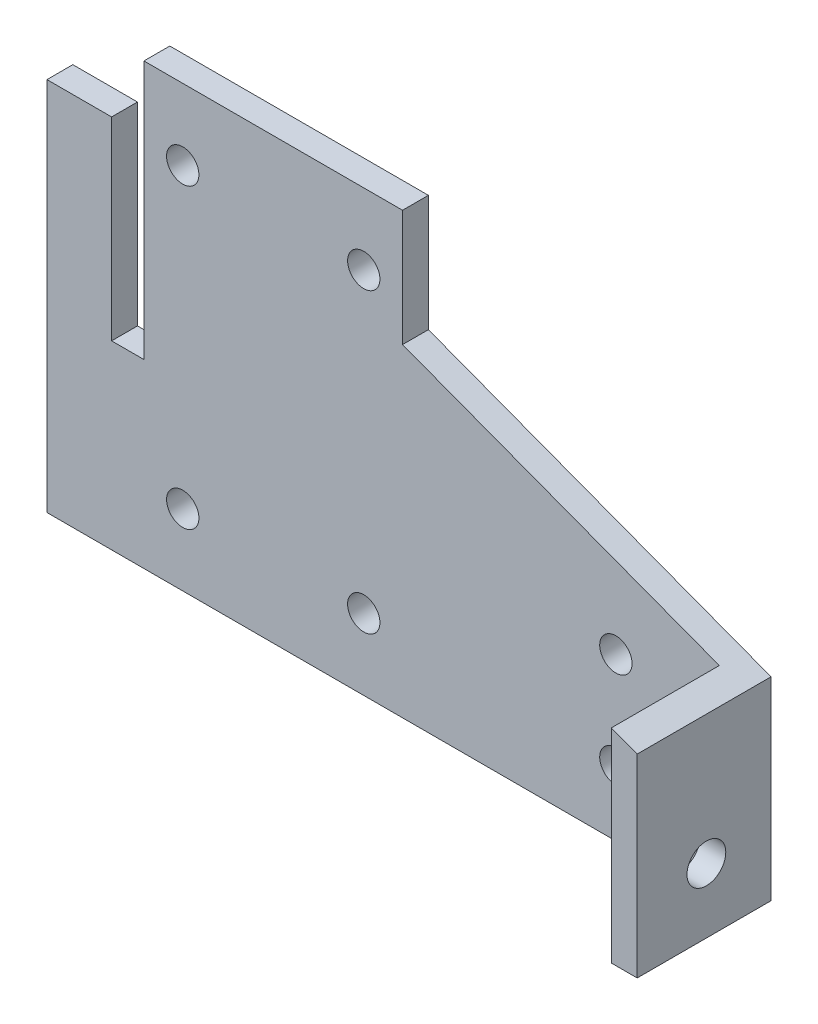
ISO-10303-21;
HEADER;
FILE_DESCRIPTION(('STEP AP214'),'2;1');
FILE_NAME('part.step','',(''),(''),'','','');
FILE_SCHEMA(('AUTOMOTIVE_DESIGN { 1 0 10303 214 1 1 1 1 }'));
ENDSEC;
DATA;
#1=APPLICATION_CONTEXT('core data for automotive mechanical design processes');
#2=APPLICATION_PROTOCOL_DEFINITION('international standard','automotive_design',2000,#1);
#3=PRODUCT_CONTEXT('',#1,'mechanical');
#4=PRODUCT('Part','Part','',(#3));
#5=PRODUCT_RELATED_PRODUCT_CATEGORY('part','',(#4));
#6=PRODUCT_DEFINITION_FORMATION('','',#4);
#7=PRODUCT_DEFINITION_CONTEXT('part definition',#1,'design');
#8=PRODUCT_DEFINITION('design','',#6,#7);
#9=PRODUCT_DEFINITION_SHAPE('','',#8);
#10=(LENGTH_UNIT() NAMED_UNIT(*) SI_UNIT(.MILLI.,.METRE.));
#11=(NAMED_UNIT(*) PLANE_ANGLE_UNIT() SI_UNIT($,.RADIAN.));
#12=(NAMED_UNIT(*) SI_UNIT($,.STERADIAN.) SOLID_ANGLE_UNIT());
#13=UNCERTAINTY_MEASURE_WITH_UNIT(LENGTH_MEASURE(1.E-05),#10,'distance_accuracy_value','');
#14=(GEOMETRIC_REPRESENTATION_CONTEXT(3) GLOBAL_UNCERTAINTY_ASSIGNED_CONTEXT((#13)) GLOBAL_UNIT_ASSIGNED_CONTEXT((#10,
#11,#12)) REPRESENTATION_CONTEXT('',''));
#15=CARTESIAN_POINT('',(0.,0.,0.));
#16=DIRECTION('',(0.,0.,1.));
#17=DIRECTION('',(1.,0.,0.));
#18=AXIS2_PLACEMENT_3D('',#15,#16,#17);
#19=CARTESIAN_POINT('',(0.,0.,4.));
#20=DIRECTION('',(0.,0.,-1.));
#21=DIRECTION('',(-1.,0.,0.));
#22=AXIS2_PLACEMENT_3D('',#19,#20,#21);
#23=PLANE('',#22);
#24=CARTESIAN_POINT('',(88.,25.,4.));
#25=DIRECTION('',(0.,0.,1.));
#26=DIRECTION('',(1.,0.,0.));
#27=AXIS2_PLACEMENT_3D('',#24,#25,#26);
#28=CIRCLE('',#27,2.5);
#29=CARTESIAN_POINT('',(90.5,25.,4.));
#30=VERTEX_POINT('',#29);
#31=EDGE_CURVE('E178',#30,#30,#28,.T.);
#32=ORIENTED_EDGE('',*,*,#31,.F.);
#33=EDGE_LOOP('',(#32));
#34=FACE_BOUND('',#33,.T.);
#35=CARTESIAN_POINT('',(88.,10.,4.));
#36=DIRECTION('',(0.,0.,1.));
#37=DIRECTION('',(1.,0.,0.));
#38=AXIS2_PLACEMENT_3D('',#35,#36,#37);
#39=CIRCLE('',#38,2.5);
#40=CARTESIAN_POINT('',(90.5,10.,4.));
#41=VERTEX_POINT('',#40);
#42=EDGE_CURVE('E186',#41,#41,#39,.T.);
#43=ORIENTED_EDGE('',*,*,#42,.F.);
#44=EDGE_LOOP('',(#43));
#45=FACE_BOUND('',#44,.T.);
#46=CARTESIAN_POINT('',(49.,11.,4.));
#47=DIRECTION('',(0.,0.,1.));
#48=DIRECTION('',(1.,0.,0.));
#49=AXIS2_PLACEMENT_3D('',#46,#47,#48);
#50=CIRCLE('',#49,2.5);
#51=CARTESIAN_POINT('',(51.5,11.,4.));
#52=VERTEX_POINT('',#51);
#53=EDGE_CURVE('E192',#52,#52,#50,.T.);
#54=ORIENTED_EDGE('',*,*,#53,.F.);
#55=EDGE_LOOP('',(#54));
#56=FACE_BOUND('',#55,.T.);
#57=CARTESIAN_POINT('',(21.,11.,4.));
#58=DIRECTION('',(0.,0.,1.));
#59=DIRECTION('',(1.,0.,0.));
#60=AXIS2_PLACEMENT_3D('',#57,#58,#59);
#61=CIRCLE('',#60,2.5);
#62=CARTESIAN_POINT('',(23.5,11.,4.));
#63=VERTEX_POINT('',#62);
#64=EDGE_CURVE('E198',#63,#63,#61,.T.);
#65=ORIENTED_EDGE('',*,*,#64,.F.);
#66=EDGE_LOOP('',(#65));
#67=FACE_BOUND('',#66,.T.);
#68=CARTESIAN_POINT('',(49.,57.,4.));
#69=DIRECTION('',(0.,0.,1.));
#70=DIRECTION('',(1.,0.,0.));
#71=AXIS2_PLACEMENT_3D('',#68,#69,#70);
#72=CIRCLE('',#71,2.5);
#73=CARTESIAN_POINT('',(51.5,57.,4.));
#74=VERTEX_POINT('',#73);
#75=EDGE_CURVE('E204',#74,#74,#72,.T.);
#76=ORIENTED_EDGE('',*,*,#75,.F.);
#77=EDGE_LOOP('',(#76));
#78=FACE_BOUND('',#77,.T.);
#79=CARTESIAN_POINT('',(21.,57.,4.));
#80=DIRECTION('',(0.,0.,1.));
#81=DIRECTION('',(1.,0.,0.));
#82=AXIS2_PLACEMENT_3D('',#79,#80,#81);
#83=CIRCLE('',#82,2.5);
#84=CARTESIAN_POINT('',(23.5,57.,4.));
#85=VERTEX_POINT('',#84);
#86=EDGE_CURVE('E208',#85,#85,#83,.T.);
#87=ORIENTED_EDGE('',*,*,#86,.F.);
#88=EDGE_LOOP('',(#87));
#89=FACE_BOUND('',#88,.T.);
#90=DIRECTION('',(-1.,0.,0.));
#91=VECTOR('',#90,1.);
#92=CARTESIAN_POINT('',(0.,68.,4.));
#93=LINE('',#92,#91);
#94=CARTESIAN_POINT('',(55.,68.,4.));
#95=VERTEX_POINT('',#94);
#96=CARTESIAN_POINT('',(15.,68.,4.));
#97=VERTEX_POINT('',#96);
#98=EDGE_CURVE('E289',#95,#97,#93,.T.);
#99=ORIENTED_EDGE('',*,*,#98,.T.);
#100=DIRECTION('',(0.,1.,0.));
#101=VECTOR('',#100,1.);
#102=CARTESIAN_POINT('',(15.,68.,4.));
#103=LINE('',#102,#101);
#104=CARTESIAN_POINT('',(15.,28.,4.));
#105=VERTEX_POINT('',#104);
#106=EDGE_CURVE('E50',#105,#97,#103,.T.);
#107=ORIENTED_EDGE('',*,*,#106,.F.);
#108=DIRECTION('',(1.,0.,0.));
#109=VECTOR('',#108,1.);
#110=CARTESIAN_POINT('',(15.,28.,4.));
#111=LINE('',#110,#109);
#112=CARTESIAN_POINT('',(10.,28.,4.));
#113=VERTEX_POINT('',#112);
#114=EDGE_CURVE('E332',#113,#105,#111,.T.);
#115=ORIENTED_EDGE('',*,*,#114,.F.);
#116=DIRECTION('',(0.,-1.,0.));
#117=VECTOR('',#116,1.);
#118=CARTESIAN_POINT('',(10.,58.,4.));
#119=LINE('',#118,#117);
#120=CARTESIAN_POINT('',(10.,58.,4.));
#121=VERTEX_POINT('',#120);
#122=EDGE_CURVE('E141',#121,#113,#119,.T.);
#123=ORIENTED_EDGE('',*,*,#122,.F.);
#124=DIRECTION('',(1.,0.,0.));
#125=VECTOR('',#124,1.);
#126=CARTESIAN_POINT('',(0.,58.,4.));
#127=LINE('',#126,#125);
#128=CARTESIAN_POINT('',(0.,58.,4.));
#129=VERTEX_POINT('',#128);
#130=EDGE_CURVE('E127',#129,#121,#127,.T.);
#131=ORIENTED_EDGE('',*,*,#130,.F.);
#132=DIRECTION('',(0.,-1.,0.));
#133=VECTOR('',#132,1.);
#134=CARTESIAN_POINT('',(0.,0.,4.));
#135=LINE('',#134,#133);
#136=CARTESIAN_POINT('',(0.,0.,4.));
#137=VERTEX_POINT('',#136);
#138=EDGE_CURVE('E137',#129,#137,#135,.T.);
#139=ORIENTED_EDGE('',*,*,#138,.T.);
#140=DIRECTION('',(1.,0.,0.));
#141=VECTOR('',#140,1.);
#142=CARTESIAN_POINT('',(0.,0.,4.));
#143=LINE('',#142,#141);
#144=CARTESIAN_POINT('',(104.,0.,4.));
#145=VERTEX_POINT('',#144);
#146=EDGE_CURVE('E146',#137,#145,#143,.T.);
#147=ORIENTED_EDGE('',*,*,#146,.T.);
#148=DIRECTION('',(0.,-1.,0.));
#149=VECTOR('',#148,1.);
#150=CARTESIAN_POINT('',(104.,0.,4.));
#151=LINE('',#150,#149);
#152=CARTESIAN_POINT('',(104.,31.5094339622642,4.));
#153=VERTEX_POINT('',#152);
#154=EDGE_CURVE('E58',#153,#145,#151,.T.);
#155=ORIENTED_EDGE('',*,*,#154,.F.);
#156=DIRECTION('',(-0.935601718950742,0.353057252434242,0.));
#157=VECTOR('',#156,1.);
#158=CARTESIAN_POINT('',(108.,30.,4.));
#159=LINE('',#158,#157);
#160=CARTESIAN_POINT('',(55.,50.,4.));
#161=VERTEX_POINT('',#160);
#162=EDGE_CURVE('E149',#153,#161,#159,.T.);
#163=ORIENTED_EDGE('',*,*,#162,.T.);
#164=DIRECTION('',(0.,1.,0.));
#165=VECTOR('',#164,1.);
#166=CARTESIAN_POINT('',(55.,68.,4.));
#167=LINE('',#166,#165);
#168=EDGE_CURVE('E166',#161,#95,#167,.T.);
#169=ORIENTED_EDGE('',*,*,#168,.T.);
#170=EDGE_LOOP('',(#99,#107,#115,#123,#131,#139,#147,#155,#163,#169));
#171=FACE_BOUND('',#170,.T.);
#172=ADVANCED_FACE('F35',(#34,#45,#56,#67,#78,#89,#171),#23,.F.);
#173=CARTESIAN_POINT('',(0.,0.,0.));
#174=DIRECTION('',(0.,0.,-1.));
#175=DIRECTION('',(-1.,0.,0.));
#176=AXIS2_PLACEMENT_3D('',#173,#174,#175);
#177=PLANE('',#176);
#178=DIRECTION('',(0.,-1.,0.));
#179=VECTOR('',#178,1.);
#180=CARTESIAN_POINT('',(15.,0.,0.));
#181=LINE('',#180,#179);
#182=CARTESIAN_POINT('',(15.,68.,0.));
#183=VERTEX_POINT('',#182);
#184=CARTESIAN_POINT('',(15.,28.,0.));
#185=VERTEX_POINT('',#184);
#186=EDGE_CURVE('E324',#183,#185,#181,.T.);
#187=ORIENTED_EDGE('',*,*,#186,.F.);
#188=DIRECTION('',(-1.,0.,0.));
#189=VECTOR('',#188,1.);
#190=CARTESIAN_POINT('',(0.,68.,0.));
#191=LINE('',#190,#189);
#192=CARTESIAN_POINT('',(55.,68.,0.));
#193=VERTEX_POINT('',#192);
#194=EDGE_CURVE('E147',#193,#183,#191,.T.);
#195=ORIENTED_EDGE('',*,*,#194,.F.);
#196=DIRECTION('',(0.,1.,0.));
#197=VECTOR('',#196,1.);
#198=CARTESIAN_POINT('',(55.,68.,0.));
#199=LINE('',#198,#197);
#200=CARTESIAN_POINT('',(55.,50.,0.));
#201=VERTEX_POINT('',#200);
#202=EDGE_CURVE('E152',#201,#193,#199,.T.);
#203=ORIENTED_EDGE('',*,*,#202,.F.);
#204=DIRECTION('',(-0.935601718950742,0.353057252434242,0.));
#205=VECTOR('',#204,1.);
#206=CARTESIAN_POINT('',(108.,30.,0.));
#207=LINE('',#206,#205);
#208=CARTESIAN_POINT('',(108.,30.,0.));
#209=VERTEX_POINT('',#208);
#210=EDGE_CURVE('E280',#209,#201,#207,.T.);
#211=ORIENTED_EDGE('',*,*,#210,.F.);
#212=DIRECTION('',(0.,1.,0.));
#213=VECTOR('',#212,1.);
#214=CARTESIAN_POINT('',(108.,0.,0.));
#215=LINE('',#214,#213);
#216=CARTESIAN_POINT('',(108.,0.,0.));
#217=VERTEX_POINT('',#216);
#218=EDGE_CURVE('E269',#217,#209,#215,.T.);
#219=ORIENTED_EDGE('',*,*,#218,.F.);
#220=DIRECTION('',(1.,0.,0.));
#221=VECTOR('',#220,1.);
#222=CARTESIAN_POINT('',(0.,0.,0.));
#223=LINE('',#222,#221);
#224=CARTESIAN_POINT('',(0.,0.,0.));
#225=VERTEX_POINT('',#224);
#226=EDGE_CURVE('E213',#225,#217,#223,.T.);
#227=ORIENTED_EDGE('',*,*,#226,.F.);
#228=DIRECTION('',(0.,-1.,0.));
#229=VECTOR('',#228,1.);
#230=CARTESIAN_POINT('',(0.,0.,0.));
#231=LINE('',#230,#229);
#232=CARTESIAN_POINT('',(0.,58.,0.));
#233=VERTEX_POINT('',#232);
#234=EDGE_CURVE('E210',#233,#225,#231,.T.);
#235=ORIENTED_EDGE('',*,*,#234,.F.);
#236=DIRECTION('',(-1.,0.,0.));
#237=VECTOR('',#236,1.);
#238=CARTESIAN_POINT('',(0.,58.,0.));
#239=LINE('',#238,#237);
#240=CARTESIAN_POINT('',(10.,58.,0.));
#241=VERTEX_POINT('',#240);
#242=EDGE_CURVE('E130',#241,#233,#239,.T.);
#243=ORIENTED_EDGE('',*,*,#242,.F.);
#244=DIRECTION('',(0.,1.,0.));
#245=VECTOR('',#244,1.);
#246=CARTESIAN_POINT('',(10.,0.,0.));
#247=LINE('',#246,#245);
#248=CARTESIAN_POINT('',(10.,28.,0.));
#249=VERTEX_POINT('',#248);
#250=EDGE_CURVE('E43',#249,#241,#247,.T.);
#251=ORIENTED_EDGE('',*,*,#250,.F.);
#252=DIRECTION('',(-1.,0.,0.));
#253=VECTOR('',#252,1.);
#254=CARTESIAN_POINT('',(0.,28.,0.));
#255=LINE('',#254,#253);
#256=EDGE_CURVE('E11',#185,#249,#255,.T.);
#257=ORIENTED_EDGE('',*,*,#256,.F.);
#258=EDGE_LOOP('',(#187,#195,#203,#211,#219,#227,#235,#243,#251,#257));
#259=FACE_BOUND('',#258,.T.);
#260=CARTESIAN_POINT('',(88.,10.,0.));
#261=DIRECTION('',(0.,0.,1.));
#262=DIRECTION('',(1.,0.,0.));
#263=AXIS2_PLACEMENT_3D('',#260,#261,#262);
#264=CIRCLE('',#263,2.5);
#265=CARTESIAN_POINT('',(90.5,10.,0.));
#266=VERTEX_POINT('',#265);
#267=EDGE_CURVE('E181',#266,#266,#264,.T.);
#268=ORIENTED_EDGE('',*,*,#267,.T.);
#269=EDGE_LOOP('',(#268));
#270=FACE_BOUND('',#269,.T.);
#271=CARTESIAN_POINT('',(21.,11.,0.));
#272=DIRECTION('',(0.,0.,1.));
#273=DIRECTION('',(1.,0.,0.));
#274=AXIS2_PLACEMENT_3D('',#271,#272,#273);
#275=CIRCLE('',#274,2.5);
#276=CARTESIAN_POINT('',(23.5,11.,0.));
#277=VERTEX_POINT('',#276);
#278=EDGE_CURVE('E195',#277,#277,#275,.T.);
#279=ORIENTED_EDGE('',*,*,#278,.T.);
#280=EDGE_LOOP('',(#279));
#281=FACE_BOUND('',#280,.T.);
#282=CARTESIAN_POINT('',(21.,57.,0.));
#283=DIRECTION('',(0.,0.,1.));
#284=DIRECTION('',(1.,0.,0.));
#285=AXIS2_PLACEMENT_3D('',#282,#283,#284);
#286=CIRCLE('',#285,2.5);
#287=CARTESIAN_POINT('',(23.5,57.,0.));
#288=VERTEX_POINT('',#287);
#289=EDGE_CURVE('E156',#288,#288,#286,.T.);
#290=ORIENTED_EDGE('',*,*,#289,.T.);
#291=EDGE_LOOP('',(#290));
#292=FACE_BOUND('',#291,.T.);
#293=CARTESIAN_POINT('',(49.,57.,0.));
#294=DIRECTION('',(0.,0.,1.));
#295=DIRECTION('',(1.,0.,0.));
#296=AXIS2_PLACEMENT_3D('',#293,#294,#295);
#297=CIRCLE('',#296,2.5);
#298=CARTESIAN_POINT('',(51.5,57.,0.));
#299=VERTEX_POINT('',#298);
#300=EDGE_CURVE('E201',#299,#299,#297,.T.);
#301=ORIENTED_EDGE('',*,*,#300,.T.);
#302=EDGE_LOOP('',(#301));
#303=FACE_BOUND('',#302,.T.);
#304=CARTESIAN_POINT('',(49.,11.,0.));
#305=DIRECTION('',(0.,0.,1.));
#306=DIRECTION('',(1.,0.,0.));
#307=AXIS2_PLACEMENT_3D('',#304,#305,#306);
#308=CIRCLE('',#307,2.5);
#309=CARTESIAN_POINT('',(51.5,11.,0.));
#310=VERTEX_POINT('',#309);
#311=EDGE_CURVE('E189',#310,#310,#308,.T.);
#312=ORIENTED_EDGE('',*,*,#311,.T.);
#313=EDGE_LOOP('',(#312));
#314=FACE_BOUND('',#313,.T.);
#315=CARTESIAN_POINT('',(88.,25.,0.));
#316=DIRECTION('',(0.,0.,1.));
#317=DIRECTION('',(1.,0.,0.));
#318=AXIS2_PLACEMENT_3D('',#315,#316,#317);
#319=CIRCLE('',#318,2.5);
#320=CARTESIAN_POINT('',(90.5,25.,0.));
#321=VERTEX_POINT('',#320);
#322=EDGE_CURVE('E182',#321,#321,#319,.T.);
#323=ORIENTED_EDGE('',*,*,#322,.T.);
#324=EDGE_LOOP('',(#323));
#325=FACE_BOUND('',#324,.T.);
#326=ADVANCED_FACE('F218',(#259,#270,#281,#292,#303,#314,#325),#177,.T.);
#327=CARTESIAN_POINT('',(0.,0.,4.));
#328=DIRECTION('',(1.,0.,0.));
#329=DIRECTION('',(0.,0.,-1.));
#330=AXIS2_PLACEMENT_3D('',#327,#328,#329);
#331=PLANE('',#330);
#332=ORIENTED_EDGE('',*,*,#138,.F.);
#333=DIRECTION('',(0.,0.,1.));
#334=VECTOR('',#333,1.);
#335=CARTESIAN_POINT('',(0.,58.,-6.));
#336=LINE('',#335,#334);
#337=EDGE_CURVE('E123',#233,#129,#336,.T.);
#338=ORIENTED_EDGE('',*,*,#337,.F.);
#339=ORIENTED_EDGE('',*,*,#234,.T.);
#340=DIRECTION('',(0.,0.,-1.));
#341=VECTOR('',#340,1.);
#342=CARTESIAN_POINT('',(0.,0.,4.));
#343=LINE('',#342,#341);
#344=EDGE_CURVE('E145',#137,#225,#343,.T.);
#345=ORIENTED_EDGE('',*,*,#344,.F.);
#346=EDGE_LOOP('',(#332,#338,#339,#345));
#347=FACE_BOUND('',#346,.T.);
#348=ADVANCED_FACE('F37',(#347),#331,.F.);
#349=CARTESIAN_POINT('',(0.,0.,4.));
#350=DIRECTION('',(0.,1.,0.));
#351=DIRECTION('',(0.,0.,1.));
#352=AXIS2_PLACEMENT_3D('',#349,#350,#351);
#353=PLANE('',#352);
#354=ORIENTED_EDGE('',*,*,#226,.T.);
#355=DIRECTION('',(0.,0.,-1.));
#356=VECTOR('',#355,1.);
#357=CARTESIAN_POINT('',(108.,0.,4.));
#358=LINE('',#357,#356);
#359=CARTESIAN_POINT('',(108.,0.,20.7));
#360=VERTEX_POINT('',#359);
#361=EDGE_CURVE('E266',#360,#217,#358,.T.);
#362=ORIENTED_EDGE('',*,*,#361,.F.);
#363=DIRECTION('',(1.,0.,0.));
#364=VECTOR('',#363,1.);
#365=CARTESIAN_POINT('',(108.,0.,20.7));
#366=LINE('',#365,#364);
#367=CARTESIAN_POINT('',(104.,0.,20.7));
#368=VERTEX_POINT('',#367);
#369=EDGE_CURVE('E176',#368,#360,#366,.T.);
#370=ORIENTED_EDGE('',*,*,#369,.F.);
#371=DIRECTION('',(0.,0.,-1.));
#372=VECTOR('',#371,1.);
#373=CARTESIAN_POINT('',(104.,0.,20.7));
#374=LINE('',#373,#372);
#375=EDGE_CURVE('E171',#368,#145,#374,.T.);
#376=ORIENTED_EDGE('',*,*,#375,.T.);
#377=ORIENTED_EDGE('',*,*,#146,.F.);
#378=ORIENTED_EDGE('',*,*,#344,.T.);
#379=EDGE_LOOP('',(#354,#362,#370,#376,#377,#378));
#380=FACE_BOUND('',#379,.T.);
#381=ADVANCED_FACE('F256',(#380),#353,.F.);
#382=CARTESIAN_POINT('',(108.,0.,4.));
#383=DIRECTION('',(-1.,0.,0.));
#384=DIRECTION('',(0.,0.,1.));
#385=AXIS2_PLACEMENT_3D('',#382,#383,#384);
#386=PLANE('',#385);
#387=CARTESIAN_POINT('',(108.,10.,10.));
#388=DIRECTION('',(1.,0.,0.));
#389=DIRECTION('',(0.,0.,-1.));
#390=AXIS2_PLACEMENT_3D('',#387,#388,#389);
#391=CIRCLE('',#390,3.);
#392=CARTESIAN_POINT('',(108.,10.,7.));
#393=VERTEX_POINT('',#392);
#394=EDGE_CURVE('E304',#393,#393,#391,.T.);
#395=ORIENTED_EDGE('',*,*,#394,.F.);
#396=EDGE_LOOP('',(#395));
#397=FACE_BOUND('',#396,.T.);
#398=ORIENTED_EDGE('',*,*,#218,.T.);
#399=DIRECTION('',(0.,0.,-1.));
#400=VECTOR('',#399,1.);
#401=CARTESIAN_POINT('',(108.,30.,4.));
#402=LINE('',#401,#400);
#403=CARTESIAN_POINT('',(108.,30.,20.7));
#404=VERTEX_POINT('',#403);
#405=EDGE_CURVE('E275',#404,#209,#402,.T.);
#406=ORIENTED_EDGE('',*,*,#405,.F.);
#407=DIRECTION('',(0.,1.,0.));
#408=VECTOR('',#407,1.);
#409=CARTESIAN_POINT('',(108.,30.,20.7));
#410=LINE('',#409,#408);
#411=EDGE_CURVE('E169',#360,#404,#410,.T.);
#412=ORIENTED_EDGE('',*,*,#411,.F.);
#413=ORIENTED_EDGE('',*,*,#361,.T.);
#414=EDGE_LOOP('',(#398,#406,#412,#413));
#415=FACE_BOUND('',#414,.T.);
#416=ADVANCED_FACE('F253',(#397,#415),#386,.F.);
#417=CARTESIAN_POINT('',(108.,30.,4.));
#418=DIRECTION('',(-0.353057252434242,-0.935601718950742,0.));
#419=DIRECTION('',(0.935601718950742,-0.353057252434242,0.));
#420=AXIS2_PLACEMENT_3D('',#417,#418,#419);
#421=PLANE('',#420);
#422=ORIENTED_EDGE('',*,*,#210,.T.);
#423=DIRECTION('',(0.,0.,-1.));
#424=VECTOR('',#423,1.);
#425=CARTESIAN_POINT('',(55.,50.,4.));
#426=LINE('',#425,#424);
#427=EDGE_CURVE('E288',#161,#201,#426,.T.);
#428=ORIENTED_EDGE('',*,*,#427,.F.);
#429=ORIENTED_EDGE('',*,*,#162,.F.);
#430=DIRECTION('',(0.,0.,-1.));
#431=VECTOR('',#430,1.);
#432=CARTESIAN_POINT('',(104.,31.5094339622642,20.7));
#433=LINE('',#432,#431);
#434=CARTESIAN_POINT('',(104.,31.5094339622642,20.7));
#435=VERTEX_POINT('',#434);
#436=EDGE_CURVE('E185',#435,#153,#433,.T.);
#437=ORIENTED_EDGE('',*,*,#436,.F.);
#438=DIRECTION('',(-0.935601718950742,0.353057252434243,0.));
#439=VECTOR('',#438,1.);
#440=CARTESIAN_POINT('',(104.,31.5094339622642,20.7));
#441=LINE('',#440,#439);
#442=EDGE_CURVE('E295',#404,#435,#441,.T.);
#443=ORIENTED_EDGE('',*,*,#442,.F.);
#444=ORIENTED_EDGE('',*,*,#405,.T.);
#445=EDGE_LOOP('',(#422,#428,#429,#437,#443,#444));
#446=FACE_BOUND('',#445,.T.);
#447=ADVANCED_FACE('F249',(#446),#421,.F.);
#448=CARTESIAN_POINT('',(55.,68.,4.));
#449=DIRECTION('',(-1.,0.,0.));
#450=DIRECTION('',(0.,-1.,0.));
#451=AXIS2_PLACEMENT_3D('',#448,#449,#450);
#452=PLANE('',#451);
#453=ORIENTED_EDGE('',*,*,#202,.T.);
#454=DIRECTION('',(0.,0.,-1.));
#455=VECTOR('',#454,1.);
#456=CARTESIAN_POINT('',(55.,68.,4.));
#457=LINE('',#456,#455);
#458=EDGE_CURVE('E285',#95,#193,#457,.T.);
#459=ORIENTED_EDGE('',*,*,#458,.F.);
#460=ORIENTED_EDGE('',*,*,#168,.F.);
#461=ORIENTED_EDGE('',*,*,#427,.T.);
#462=EDGE_LOOP('',(#453,#459,#460,#461));
#463=FACE_BOUND('',#462,.T.);
#464=ADVANCED_FACE('F233',(#463),#452,.F.);
#465=CARTESIAN_POINT('',(0.,68.,4.));
#466=DIRECTION('',(0.,-1.,0.));
#467=DIRECTION('',(0.,0.,-1.));
#468=AXIS2_PLACEMENT_3D('',#465,#466,#467);
#469=PLANE('',#468);
#470=ORIENTED_EDGE('',*,*,#194,.T.);
#471=DIRECTION('',(0.,0.,1.));
#472=VECTOR('',#471,1.);
#473=CARTESIAN_POINT('',(15.,68.,4.));
#474=LINE('',#473,#472);
#475=EDGE_CURVE('E316',#183,#97,#474,.T.);
#476=ORIENTED_EDGE('',*,*,#475,.T.);
#477=ORIENTED_EDGE('',*,*,#98,.F.);
#478=ORIENTED_EDGE('',*,*,#458,.T.);
#479=EDGE_LOOP('',(#470,#476,#477,#478));
#480=FACE_BOUND('',#479,.T.);
#481=ADVANCED_FACE('F224',(#480),#469,.F.);
#482=CARTESIAN_POINT('',(21.,57.,4.));
#483=DIRECTION('',(0.,0.,-1.));
#484=DIRECTION('',(-1.,0.,0.));
#485=AXIS2_PLACEMENT_3D('',#482,#483,#484);
#486=CYLINDRICAL_SURFACE('',#485,2.5);
#487=ORIENTED_EDGE('',*,*,#86,.T.);
#488=EDGE_LOOP('',(#487));
#489=FACE_BOUND('',#488,.T.);
#490=ORIENTED_EDGE('',*,*,#289,.F.);
#491=EDGE_LOOP('',(#490));
#492=FACE_BOUND('',#491,.T.);
#493=ADVANCED_FACE('F221',(#489,#492),#486,.F.);
#494=CARTESIAN_POINT('',(49.,57.,4.));
#495=DIRECTION('',(0.,0.,-1.));
#496=DIRECTION('',(-1.,0.,0.));
#497=AXIS2_PLACEMENT_3D('',#494,#495,#496);
#498=CYLINDRICAL_SURFACE('',#497,2.5);
#499=ORIENTED_EDGE('',*,*,#75,.T.);
#500=EDGE_LOOP('',(#499));
#501=FACE_BOUND('',#500,.T.);
#502=ORIENTED_EDGE('',*,*,#300,.F.);
#503=EDGE_LOOP('',(#502));
#504=FACE_BOUND('',#503,.T.);
#505=ADVANCED_FACE('F223',(#501,#504),#498,.F.);
#506=CARTESIAN_POINT('',(21.,11.,4.));
#507=DIRECTION('',(0.,0.,-1.));
#508=DIRECTION('',(-1.,0.,0.));
#509=AXIS2_PLACEMENT_3D('',#506,#507,#508);
#510=CYLINDRICAL_SURFACE('',#509,2.5);
#511=ORIENTED_EDGE('',*,*,#64,.T.);
#512=EDGE_LOOP('',(#511));
#513=FACE_BOUND('',#512,.T.);
#514=ORIENTED_EDGE('',*,*,#278,.F.);
#515=EDGE_LOOP('',(#514));
#516=FACE_BOUND('',#515,.T.);
#517=ADVANCED_FACE('F230',(#513,#516),#510,.F.);
#518=CARTESIAN_POINT('',(49.,11.,4.));
#519=DIRECTION('',(0.,0.,-1.));
#520=DIRECTION('',(-1.,0.,0.));
#521=AXIS2_PLACEMENT_3D('',#518,#519,#520);
#522=CYLINDRICAL_SURFACE('',#521,2.5);
#523=ORIENTED_EDGE('',*,*,#53,.T.);
#524=EDGE_LOOP('',(#523));
#525=FACE_BOUND('',#524,.T.);
#526=ORIENTED_EDGE('',*,*,#311,.F.);
#527=EDGE_LOOP('',(#526));
#528=FACE_BOUND('',#527,.T.);
#529=ADVANCED_FACE('F372',(#525,#528),#522,.F.);
#530=CARTESIAN_POINT('',(88.,10.,4.));
#531=DIRECTION('',(0.,0.,-1.));
#532=DIRECTION('',(-1.,0.,0.));
#533=AXIS2_PLACEMENT_3D('',#530,#531,#532);
#534=CYLINDRICAL_SURFACE('',#533,2.5);
#535=ORIENTED_EDGE('',*,*,#42,.T.);
#536=EDGE_LOOP('',(#535));
#537=FACE_BOUND('',#536,.T.);
#538=ORIENTED_EDGE('',*,*,#267,.F.);
#539=EDGE_LOOP('',(#538));
#540=FACE_BOUND('',#539,.T.);
#541=ADVANCED_FACE('F368',(#537,#540),#534,.F.);
#542=CARTESIAN_POINT('',(88.,25.,4.));
#543=DIRECTION('',(0.,0.,-1.));
#544=DIRECTION('',(-1.,0.,0.));
#545=AXIS2_PLACEMENT_3D('',#542,#543,#544);
#546=CYLINDRICAL_SURFACE('',#545,2.5);
#547=ORIENTED_EDGE('',*,*,#31,.T.);
#548=EDGE_LOOP('',(#547));
#549=FACE_BOUND('',#548,.T.);
#550=ORIENTED_EDGE('',*,*,#322,.F.);
#551=EDGE_LOOP('',(#550));
#552=FACE_BOUND('',#551,.T.);
#553=ADVANCED_FACE('F364',(#549,#552),#546,.F.);
#554=CARTESIAN_POINT('',(104.,0.,20.7));
#555=DIRECTION('',(1.,0.,0.));
#556=DIRECTION('',(0.,0.,-1.));
#557=AXIS2_PLACEMENT_3D('',#554,#555,#556);
#558=PLANE('',#557);
#559=CARTESIAN_POINT('',(104.,10.,10.));
#560=DIRECTION('',(1.,0.,0.));
#561=DIRECTION('',(0.,0.,-1.));
#562=AXIS2_PLACEMENT_3D('',#559,#560,#561);
#563=CIRCLE('',#562,3.);
#564=CARTESIAN_POINT('',(104.,10.,7.));
#565=VERTEX_POINT('',#564);
#566=EDGE_CURVE('E170',#565,#565,#563,.T.);
#567=ORIENTED_EDGE('',*,*,#566,.T.);
#568=EDGE_LOOP('',(#567));
#569=FACE_BOUND('',#568,.T.);
#570=ORIENTED_EDGE('',*,*,#154,.T.);
#571=ORIENTED_EDGE('',*,*,#375,.F.);
#572=DIRECTION('',(0.,-1.,0.));
#573=VECTOR('',#572,1.);
#574=CARTESIAN_POINT('',(104.,0.,20.7));
#575=LINE('',#574,#573);
#576=EDGE_CURVE('E299',#435,#368,#575,.T.);
#577=ORIENTED_EDGE('',*,*,#576,.F.);
#578=ORIENTED_EDGE('',*,*,#436,.T.);
#579=EDGE_LOOP('',(#570,#571,#577,#578));
#580=FACE_BOUND('',#579,.T.);
#581=ADVANCED_FACE('F361',(#569,#580),#558,.F.);
#582=CARTESIAN_POINT('',(0.,0.,20.7));
#583=DIRECTION('',(0.,0.,-1.));
#584=DIRECTION('',(-1.,0.,0.));
#585=AXIS2_PLACEMENT_3D('',#582,#583,#584);
#586=PLANE('',#585);
#587=ORIENTED_EDGE('',*,*,#411,.T.);
#588=ORIENTED_EDGE('',*,*,#442,.T.);
#589=ORIENTED_EDGE('',*,*,#576,.T.);
#590=ORIENTED_EDGE('',*,*,#369,.T.);
#591=EDGE_LOOP('',(#587,#588,#589,#590));
#592=FACE_BOUND('',#591,.T.);
#593=ADVANCED_FACE('F301',(#592),#586,.F.);
#594=CARTESIAN_POINT('',(98.,10.,10.));
#595=DIRECTION('',(1.,0.,0.));
#596=DIRECTION('',(0.,0.,-1.));
#597=AXIS2_PLACEMENT_3D('',#594,#595,#596);
#598=CYLINDRICAL_SURFACE('',#597,3.);
#599=ORIENTED_EDGE('',*,*,#394,.T.);
#600=EDGE_LOOP('',(#599));
#601=FACE_BOUND('',#600,.T.);
#602=ORIENTED_EDGE('',*,*,#566,.F.);
#603=EDGE_LOOP('',(#602));
#604=FACE_BOUND('',#603,.T.);
#605=ADVANCED_FACE('F345',(#601,#604),#598,.F.);
#606=CARTESIAN_POINT('',(15.,68.,-6.));
#607=DIRECTION('',(1.,0.,0.));
#608=DIRECTION('',(0.,1.,0.));
#609=AXIS2_PLACEMENT_3D('',#606,#607,#608);
#610=PLANE('',#609);
#611=ORIENTED_EDGE('',*,*,#186,.T.);
#612=DIRECTION('',(0.,0.,1.));
#613=VECTOR('',#612,1.);
#614=CARTESIAN_POINT('',(15.,28.,-6.));
#615=LINE('',#614,#613);
#616=EDGE_CURVE('E326',#185,#105,#615,.T.);
#617=ORIENTED_EDGE('',*,*,#616,.T.);
#618=ORIENTED_EDGE('',*,*,#106,.T.);
#619=ORIENTED_EDGE('',*,*,#475,.F.);
#620=EDGE_LOOP('',(#611,#617,#618,#619));
#621=FACE_BOUND('',#620,.T.);
#622=ADVANCED_FACE('F343',(#621),#610,.F.);
#623=CARTESIAN_POINT('',(15.,28.,-6.));
#624=DIRECTION('',(0.,-1.,0.));
#625=DIRECTION('',(0.,0.,-1.));
#626=AXIS2_PLACEMENT_3D('',#623,#624,#625);
#627=PLANE('',#626);
#628=ORIENTED_EDGE('',*,*,#256,.T.);
#629=DIRECTION('',(0.,0.,1.));
#630=VECTOR('',#629,1.);
#631=CARTESIAN_POINT('',(10.,28.,-6.));
#632=LINE('',#631,#630);
#633=EDGE_CURVE('E321',#249,#113,#632,.T.);
#634=ORIENTED_EDGE('',*,*,#633,.T.);
#635=ORIENTED_EDGE('',*,*,#114,.T.);
#636=ORIENTED_EDGE('',*,*,#616,.F.);
#637=EDGE_LOOP('',(#628,#634,#635,#636));
#638=FACE_BOUND('',#637,.T.);
#639=ADVANCED_FACE('F337',(#638),#627,.F.);
#640=CARTESIAN_POINT('',(10.,58.,-6.));
#641=DIRECTION('',(-1.,0.,0.));
#642=DIRECTION('',(0.,-1.,0.));
#643=AXIS2_PLACEMENT_3D('',#640,#641,#642);
#644=PLANE('',#643);
#645=ORIENTED_EDGE('',*,*,#250,.T.);
#646=DIRECTION('',(0.,0.,1.));
#647=VECTOR('',#646,1.);
#648=CARTESIAN_POINT('',(10.,58.,-6.));
#649=LINE('',#648,#647);
#650=EDGE_CURVE('E134',#241,#121,#649,.T.);
#651=ORIENTED_EDGE('',*,*,#650,.T.);
#652=ORIENTED_EDGE('',*,*,#122,.T.);
#653=ORIENTED_EDGE('',*,*,#633,.F.);
#654=EDGE_LOOP('',(#645,#651,#652,#653));
#655=FACE_BOUND('',#654,.T.);
#656=ADVANCED_FACE('F320',(#655),#644,.F.);
#657=CARTESIAN_POINT('',(0.,58.,-6.));
#658=DIRECTION('',(0.,-1.,0.));
#659=DIRECTION('',(0.,0.,-1.));
#660=AXIS2_PLACEMENT_3D('',#657,#658,#659);
#661=PLANE('',#660);
#662=ORIENTED_EDGE('',*,*,#242,.T.);
#663=ORIENTED_EDGE('',*,*,#337,.T.);
#664=ORIENTED_EDGE('',*,*,#130,.T.);
#665=ORIENTED_EDGE('',*,*,#650,.F.);
#666=EDGE_LOOP('',(#662,#663,#664,#665));
#667=FACE_BOUND('',#666,.T.);
#668=ADVANCED_FACE('F125',(#667),#661,.F.);
#669=CLOSED_SHELL('',(#172,#326,#348,#381,#416,#447,#464,#481,#493,#505,#517,#529,#541,#553,
#581,#593,#605,#622,#639,#656,#668));
#670=MANIFOLD_SOLID_BREP('B2',#669);
#671=ADVANCED_BREP_SHAPE_REPRESENTATION('',(#18,#670),#14);
#672=SHAPE_DEFINITION_REPRESENTATION(#9,#671);
ENDSEC;
END-ISO-10303-21;
